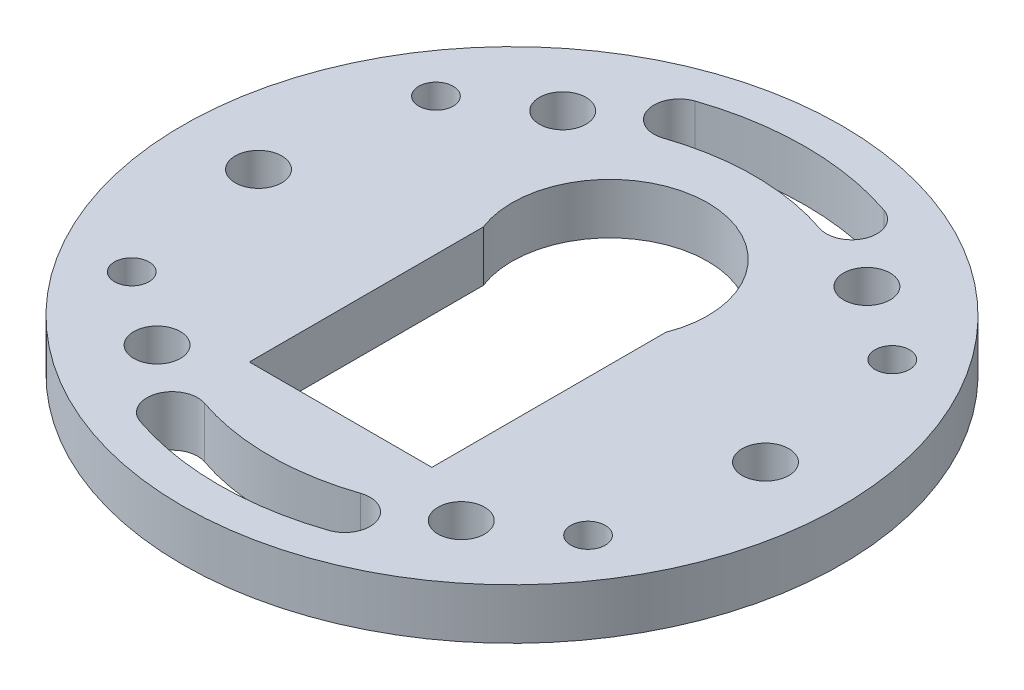
ISO-10303-21;
HEADER;
FILE_DESCRIPTION(('STEP AP214'),'2;1');
FILE_NAME('part.step','',(''),(''),'','','');
FILE_SCHEMA(('AUTOMOTIVE_DESIGN { 1 0 10303 214 1 1 1 1 }'));
ENDSEC;
DATA;
#1=APPLICATION_CONTEXT('core data for automotive mechanical design processes');
#2=APPLICATION_PROTOCOL_DEFINITION('international standard','automotive_design',2000,#1);
#3=PRODUCT_CONTEXT('',#1,'mechanical');
#4=PRODUCT('Part','Part','',(#3));
#5=PRODUCT_RELATED_PRODUCT_CATEGORY('part','',(#4));
#6=PRODUCT_DEFINITION_FORMATION('','',#4);
#7=PRODUCT_DEFINITION_CONTEXT('part definition',#1,'design');
#8=PRODUCT_DEFINITION('design','',#6,#7);
#9=PRODUCT_DEFINITION_SHAPE('','',#8);
#10=(LENGTH_UNIT() NAMED_UNIT(*) SI_UNIT(.MILLI.,.METRE.));
#11=(NAMED_UNIT(*) PLANE_ANGLE_UNIT() SI_UNIT($,.RADIAN.));
#12=(NAMED_UNIT(*) SI_UNIT($,.STERADIAN.) SOLID_ANGLE_UNIT());
#13=UNCERTAINTY_MEASURE_WITH_UNIT(LENGTH_MEASURE(1.E-05),#10,'distance_accuracy_value','');
#14=(GEOMETRIC_REPRESENTATION_CONTEXT(3) GLOBAL_UNCERTAINTY_ASSIGNED_CONTEXT((#13)) GLOBAL_UNIT_ASSIGNED_CONTEXT((#10,
#11,#12)) REPRESENTATION_CONTEXT('',''));
#15=CARTESIAN_POINT('',(0.,0.,0.));
#16=DIRECTION('',(0.,0.,1.));
#17=DIRECTION('',(1.,0.,0.));
#18=AXIS2_PLACEMENT_3D('',#15,#16,#17);
#19=CARTESIAN_POINT('',(0.,5.,0.));
#20=DIRECTION('',(0.,1.,0.));
#21=DIRECTION('',(0.,0.,1.));
#22=AXIS2_PLACEMENT_3D('',#19,#20,#21);
#23=PLANE('',#22);
#24=CARTESIAN_POINT('',(22.5,5.,-15.));
#25=DIRECTION('',(0.,1.,0.));
#26=DIRECTION('',(0.,0.,-1.));
#27=AXIS2_PLACEMENT_3D('',#24,#25,#26);
#28=CIRCLE('',#27,1.7);
#29=CARTESIAN_POINT('',(22.5,5.,-16.7));
#30=VERTEX_POINT('',#29);
#31=EDGE_CURVE('E230',#30,#30,#28,.T.);
#32=ORIENTED_EDGE('',*,*,#31,.F.);
#33=EDGE_LOOP('',(#32));
#34=FACE_BOUND('',#33,.T.);
#35=CARTESIAN_POINT('',(22.5,5.,15.));
#36=DIRECTION('',(0.,1.,0.));
#37=DIRECTION('',(0.,0.,-1.));
#38=AXIS2_PLACEMENT_3D('',#35,#36,#37);
#39=CIRCLE('',#38,1.7);
#40=CARTESIAN_POINT('',(22.5,5.,13.3));
#41=VERTEX_POINT('',#40);
#42=EDGE_CURVE('E242',#41,#41,#39,.T.);
#43=ORIENTED_EDGE('',*,*,#42,.F.);
#44=EDGE_LOOP('',(#43));
#45=FACE_BOUND('',#44,.T.);
#46=CARTESIAN_POINT('',(15.,5.,20.));
#47=DIRECTION('',(0.,1.,0.));
#48=DIRECTION('',(0.,0.,-1.));
#49=AXIS2_PLACEMENT_3D('',#46,#47,#48);
#50=CIRCLE('',#49,2.3);
#51=CARTESIAN_POINT('',(15.,5.,17.7));
#52=VERTEX_POINT('',#51);
#53=EDGE_CURVE('E254',#52,#52,#50,.T.);
#54=ORIENTED_EDGE('',*,*,#53,.F.);
#55=EDGE_LOOP('',(#54));
#56=FACE_BOUND('',#55,.T.);
#57=CARTESIAN_POINT('',(-15.,5.,20.));
#58=DIRECTION('',(0.,1.,0.));
#59=DIRECTION('',(0.,0.,1.));
#60=AXIS2_PLACEMENT_3D('',#57,#58,#59);
#61=CIRCLE('',#60,2.3);
#62=CARTESIAN_POINT('',(-15.,5.,22.3));
#63=VERTEX_POINT('',#62);
#64=EDGE_CURVE('E266',#63,#63,#61,.T.);
#65=ORIENTED_EDGE('',*,*,#64,.F.);
#66=EDGE_LOOP('',(#65));
#67=FACE_BOUND('',#66,.T.);
#68=CARTESIAN_POINT('',(-15.,5.,-20.));
#69=DIRECTION('',(0.,1.,0.));
#70=DIRECTION('',(0.,0.,1.));
#71=AXIS2_PLACEMENT_3D('',#68,#69,#70);
#72=CIRCLE('',#71,2.3);
#73=CARTESIAN_POINT('',(-15.,5.,-17.7));
#74=VERTEX_POINT('',#73);
#75=EDGE_CURVE('E278',#74,#74,#72,.T.);
#76=ORIENTED_EDGE('',*,*,#75,.F.);
#77=EDGE_LOOP('',(#76));
#78=FACE_BOUND('',#77,.T.);
#79=CARTESIAN_POINT('',(0.,5.,0.));
#80=DIRECTION('',(0.,1.,0.));
#81=DIRECTION('',(0.,0.,1.));
#82=AXIS2_PLACEMENT_3D('',#79,#80,#81);
#83=CIRCLE('',#82,32.5);
#84=CARTESIAN_POINT('',(0.,5.,32.5));
#85=VERTEX_POINT('',#84);
#86=EDGE_CURVE('E11',#85,#85,#83,.T.);
#87=ORIENTED_EDGE('',*,*,#86,.T.);
#88=EDGE_LOOP('',(#87));
#89=FACE_BOUND('',#88,.T.);
#90=CARTESIAN_POINT('',(-22.5,5.,-15.));
#91=DIRECTION('',(0.,1.,0.));
#92=DIRECTION('',(0.,0.,1.));
#93=AXIS2_PLACEMENT_3D('',#90,#91,#92);
#94=CIRCLE('',#93,1.7);
#95=CARTESIAN_POINT('',(-22.5,5.,-13.3));
#96=VERTEX_POINT('',#95);
#97=EDGE_CURVE('E272',#96,#96,#94,.T.);
#98=ORIENTED_EDGE('',*,*,#97,.F.);
#99=EDGE_LOOP('',(#98));
#100=FACE_BOUND('',#99,.T.);
#101=CARTESIAN_POINT('',(-25.,5.,0.));
#102=DIRECTION('',(0.,1.,0.));
#103=DIRECTION('',(0.,0.,1.));
#104=AXIS2_PLACEMENT_3D('',#101,#102,#103);
#105=CIRCLE('',#104,2.3);
#106=CARTESIAN_POINT('',(-25.,5.,2.3));
#107=VERTEX_POINT('',#106);
#108=EDGE_CURVE('E260',#107,#107,#105,.T.);
#109=ORIENTED_EDGE('',*,*,#108,.F.);
#110=EDGE_LOOP('',(#109));
#111=FACE_BOUND('',#110,.T.);
#112=CARTESIAN_POINT('',(-22.5,5.,15.));
#113=DIRECTION('',(0.,1.,0.));
#114=DIRECTION('',(0.,0.,1.));
#115=AXIS2_PLACEMENT_3D('',#112,#113,#114);
#116=CIRCLE('',#115,1.7);
#117=CARTESIAN_POINT('',(-22.5,5.,16.7));
#118=VERTEX_POINT('',#117);
#119=EDGE_CURVE('E248',#118,#118,#116,.T.);
#120=ORIENTED_EDGE('',*,*,#119,.F.);
#121=EDGE_LOOP('',(#120));
#122=FACE_BOUND('',#121,.T.);
#123=CARTESIAN_POINT('',(25.,5.,0.));
#124=DIRECTION('',(0.,1.,0.));
#125=DIRECTION('',(0.,0.,-1.));
#126=AXIS2_PLACEMENT_3D('',#123,#124,#125);
#127=CIRCLE('',#126,2.3);
#128=CARTESIAN_POINT('',(25.,5.,-2.3));
#129=VERTEX_POINT('',#128);
#130=EDGE_CURVE('E236',#129,#129,#127,.T.);
#131=ORIENTED_EDGE('',*,*,#130,.F.);
#132=EDGE_LOOP('',(#131));
#133=FACE_BOUND('',#132,.T.);
#134=CARTESIAN_POINT('',(15.,5.,-20.));
#135=DIRECTION('',(0.,1.,0.));
#136=DIRECTION('',(0.,0.,-1.));
#137=AXIS2_PLACEMENT_3D('',#134,#135,#136);
#138=CIRCLE('',#137,2.3);
#139=CARTESIAN_POINT('',(15.,5.,-22.3));
#140=VERTEX_POINT('',#139);
#141=EDGE_CURVE('E224',#140,#140,#138,.T.);
#142=ORIENTED_EDGE('',*,*,#141,.F.);
#143=EDGE_LOOP('',(#142));
#144=FACE_BOUND('',#143,.T.);
#145=CARTESIAN_POINT('',(-8.5,5.,25.));
#146=DIRECTION('',(0.,1.,0.));
#147=DIRECTION('',(0.,0.,-1.));
#148=AXIS2_PLACEMENT_3D('',#145,#146,#147);
#149=CIRCLE('',#148,2.5);
#150=CARTESIAN_POINT('',(-7.69524316690325,5.,22.6330681379507));
#151=VERTEX_POINT('',#150);
#152=CARTESIAN_POINT('',(-9.30475683309676,5.,27.3669318620493));
#153=VERTEX_POINT('',#152);
#154=EDGE_CURVE('E195',#151,#153,#149,.T.);
#155=ORIENTED_EDGE('',*,*,#154,.F.);
#156=CARTESIAN_POINT('',(0.,5.,0.));
#157=DIRECTION('',(0.,-1.,0.));
#158=DIRECTION('',(0.,0.,1.));
#159=AXIS2_PLACEMENT_3D('',#156,#157,#158);
#160=CIRCLE('',#159,23.9054918530218);
#161=CARTESIAN_POINT('',(7.69524316690323,5.,22.6330681379507));
#162=VERTEX_POINT('',#161);
#163=EDGE_CURVE('E193',#162,#151,#160,.T.);
#164=ORIENTED_EDGE('',*,*,#163,.F.);
#165=CARTESIAN_POINT('',(8.49999999999998,5.,25.));
#166=DIRECTION('',(0.,1.,0.));
#167=DIRECTION('',(0.,0.,-1.));
#168=AXIS2_PLACEMENT_3D('',#165,#166,#167);
#169=CIRCLE('',#168,2.5);
#170=CARTESIAN_POINT('',(9.30475683309674,5.,27.3669318620493));
#171=VERTEX_POINT('',#170);
#172=EDGE_CURVE('E201',#171,#162,#169,.T.);
#173=ORIENTED_EDGE('',*,*,#172,.F.);
#174=CARTESIAN_POINT('',(0.,5.,0.));
#175=DIRECTION('',(0.,1.,0.));
#176=DIRECTION('',(0.,0.,1.));
#177=AXIS2_PLACEMENT_3D('',#174,#175,#176);
#178=CIRCLE('',#177,28.9054918530218);
#179=EDGE_CURVE('E198',#153,#171,#178,.T.);
#180=ORIENTED_EDGE('',*,*,#179,.F.);
#181=EDGE_LOOP('',(#155,#164,#173,#180));
#182=FACE_BOUND('',#181,.T.);
#183=CARTESIAN_POINT('',(-8.5,5.,-25.));
#184=DIRECTION('',(0.,1.,0.));
#185=DIRECTION('',(0.,0.,1.));
#186=AXIS2_PLACEMENT_3D('',#183,#184,#185);
#187=CIRCLE('',#186,2.5);
#188=CARTESIAN_POINT('',(-9.30475683309676,5.,-27.3669318620493));
#189=VERTEX_POINT('',#188);
#190=CARTESIAN_POINT('',(-7.69524316690324,5.,-22.6330681379507));
#191=VERTEX_POINT('',#190);
#192=EDGE_CURVE('E164',#189,#191,#187,.T.);
#193=ORIENTED_EDGE('',*,*,#192,.F.);
#194=CARTESIAN_POINT('',(0.,5.,0.));
#195=DIRECTION('',(0.,1.,0.));
#196=DIRECTION('',(0.,0.,-1.));
#197=AXIS2_PLACEMENT_3D('',#194,#195,#196);
#198=CIRCLE('',#197,28.9054918530218);
#199=CARTESIAN_POINT('',(9.30475683309676,5.,-27.3669318620493));
#200=VERTEX_POINT('',#199);
#201=EDGE_CURVE('E162',#200,#189,#198,.T.);
#202=ORIENTED_EDGE('',*,*,#201,.F.);
#203=CARTESIAN_POINT('',(8.5,5.,-25.));
#204=DIRECTION('',(0.,1.,0.));
#205=DIRECTION('',(0.,0.,1.));
#206=AXIS2_PLACEMENT_3D('',#203,#204,#205);
#207=CIRCLE('',#206,2.5);
#208=CARTESIAN_POINT('',(7.69524316690324,5.,-22.6330681379507));
#209=VERTEX_POINT('',#208);
#210=EDGE_CURVE('E170',#209,#200,#207,.T.);
#211=ORIENTED_EDGE('',*,*,#210,.F.);
#212=CARTESIAN_POINT('',(0.,5.,0.));
#213=DIRECTION('',(0.,-1.,0.));
#214=DIRECTION('',(0.,0.,-1.));
#215=AXIS2_PLACEMENT_3D('',#212,#213,#214);
#216=CIRCLE('',#215,23.9054918530218);
#217=EDGE_CURVE('E167',#191,#209,#216,.T.);
#218=ORIENTED_EDGE('',*,*,#217,.F.);
#219=EDGE_LOOP('',(#193,#202,#211,#218));
#220=FACE_BOUND('',#219,.T.);
#221=CARTESIAN_POINT('',(0.,5.,-9.65));
#222=DIRECTION('',(0.,1.,0.));
#223=DIRECTION('',(0.,0.,1.));
#224=AXIS2_PLACEMENT_3D('',#221,#222,#223);
#225=CIRCLE('',#224,9.65);
#226=CARTESIAN_POINT('',(9.,5.,-6.16826192828926));
#227=VERTEX_POINT('',#226);
#228=CARTESIAN_POINT('',(-9.,5.,-6.16826192828926));
#229=VERTEX_POINT('',#228);
#230=EDGE_CURVE('E134',#227,#229,#225,.T.);
#231=ORIENTED_EDGE('',*,*,#230,.F.);
#232=DIRECTION('',(0.,0.,-1.));
#233=VECTOR('',#232,1.);
#234=CARTESIAN_POINT('',(9.,5.,-6.16826192828926));
#235=LINE('',#234,#233);
#236=CARTESIAN_POINT('',(9.,5.,16.9));
#237=VERTEX_POINT('',#236);
#238=EDGE_CURVE('E126',#237,#227,#235,.T.);
#239=ORIENTED_EDGE('',*,*,#238,.F.);
#240=DIRECTION('',(1.,0.,0.));
#241=VECTOR('',#240,1.);
#242=CARTESIAN_POINT('',(-9.,5.,16.9));
#243=LINE('',#242,#241);
#244=CARTESIAN_POINT('',(-9.,5.,16.9));
#245=VERTEX_POINT('',#244);
#246=EDGE_CURVE('E148',#245,#237,#243,.T.);
#247=ORIENTED_EDGE('',*,*,#246,.F.);
#248=DIRECTION('',(0.,0.,1.));
#249=VECTOR('',#248,1.);
#250=CARTESIAN_POINT('',(-9.,5.,-6.16826192828926));
#251=LINE('',#250,#249);
#252=EDGE_CURVE('E146',#229,#245,#251,.T.);
#253=ORIENTED_EDGE('',*,*,#252,.F.);
#254=EDGE_LOOP('',(#231,#239,#247,#253));
#255=FACE_BOUND('',#254,.T.);
#256=ADVANCED_FACE('F37',(#34,#45,#56,#67,#78,#89,#100,#111,#122,#133,#144,#182,#220,#255),#23,.T.);
#257=CARTESIAN_POINT('',(0.,0.,0.));
#258=DIRECTION('',(0.,1.,0.));
#259=DIRECTION('',(0.,0.,1.));
#260=AXIS2_PLACEMENT_3D('',#257,#258,#259);
#261=PLANE('',#260);
#262=CARTESIAN_POINT('',(0.,0.,0.));
#263=DIRECTION('',(0.,1.,0.));
#264=DIRECTION('',(0.,0.,-1.));
#265=AXIS2_PLACEMENT_3D('',#262,#263,#264);
#266=CIRCLE('',#265,28.9054918530218);
#267=CARTESIAN_POINT('',(9.30475683309676,0.,-27.3669318620493));
#268=VERTEX_POINT('',#267);
#269=CARTESIAN_POINT('',(-9.30475683309676,0.,-27.3669318620493));
#270=VERTEX_POINT('',#269);
#271=EDGE_CURVE('E142',#268,#270,#266,.T.);
#272=ORIENTED_EDGE('',*,*,#271,.T.);
#273=CARTESIAN_POINT('',(-8.5,0.,-25.));
#274=DIRECTION('',(0.,1.,0.));
#275=DIRECTION('',(0.,0.,1.));
#276=AXIS2_PLACEMENT_3D('',#273,#274,#275);
#277=CIRCLE('',#276,2.5);
#278=CARTESIAN_POINT('',(-7.69524316690324,0.,-22.6330681379507));
#279=VERTEX_POINT('',#278);
#280=EDGE_CURVE('E175',#270,#279,#277,.T.);
#281=ORIENTED_EDGE('',*,*,#280,.T.);
#282=CARTESIAN_POINT('',(0.,0.,0.));
#283=DIRECTION('',(0.,-1.,0.));
#284=DIRECTION('',(0.,0.,-1.));
#285=AXIS2_PLACEMENT_3D('',#282,#283,#284);
#286=CIRCLE('',#285,23.9054918530218);
#287=CARTESIAN_POINT('',(7.69524316690324,0.,-22.6330681379507));
#288=VERTEX_POINT('',#287);
#289=EDGE_CURVE('E178',#279,#288,#286,.T.);
#290=ORIENTED_EDGE('',*,*,#289,.T.);
#291=CARTESIAN_POINT('',(8.5,0.,-25.));
#292=DIRECTION('',(0.,1.,0.));
#293=DIRECTION('',(0.,0.,1.));
#294=AXIS2_PLACEMENT_3D('',#291,#292,#293);
#295=CIRCLE('',#294,2.5);
#296=EDGE_CURVE('E165',#288,#268,#295,.T.);
#297=ORIENTED_EDGE('',*,*,#296,.T.);
#298=EDGE_LOOP('',(#272,#281,#290,#297));
#299=FACE_BOUND('',#298,.T.);
#300=CARTESIAN_POINT('',(15.,0.,-20.));
#301=DIRECTION('',(0.,1.,0.));
#302=DIRECTION('',(0.,0.,-1.));
#303=AXIS2_PLACEMENT_3D('',#300,#301,#302);
#304=CIRCLE('',#303,2.3);
#305=CARTESIAN_POINT('',(15.,0.,-22.3));
#306=VERTEX_POINT('',#305);
#307=EDGE_CURVE('E223',#306,#306,#304,.T.);
#308=ORIENTED_EDGE('',*,*,#307,.T.);
#309=EDGE_LOOP('',(#308));
#310=FACE_BOUND('',#309,.T.);
#311=CARTESIAN_POINT('',(22.5,0.,-15.));
#312=DIRECTION('',(0.,1.,0.));
#313=DIRECTION('',(0.,0.,-1.));
#314=AXIS2_PLACEMENT_3D('',#311,#312,#313);
#315=CIRCLE('',#314,1.7);
#316=CARTESIAN_POINT('',(22.5,0.,-16.7));
#317=VERTEX_POINT('',#316);
#318=EDGE_CURVE('E227',#317,#317,#315,.T.);
#319=ORIENTED_EDGE('',*,*,#318,.T.);
#320=EDGE_LOOP('',(#319));
#321=FACE_BOUND('',#320,.T.);
#322=CARTESIAN_POINT('',(25.,0.,0.));
#323=DIRECTION('',(0.,1.,0.));
#324=DIRECTION('',(0.,0.,-1.));
#325=AXIS2_PLACEMENT_3D('',#322,#323,#324);
#326=CIRCLE('',#325,2.3);
#327=CARTESIAN_POINT('',(25.,0.,-2.3));
#328=VERTEX_POINT('',#327);
#329=EDGE_CURVE('E233',#328,#328,#326,.T.);
#330=ORIENTED_EDGE('',*,*,#329,.T.);
#331=EDGE_LOOP('',(#330));
#332=FACE_BOUND('',#331,.T.);
#333=CARTESIAN_POINT('',(22.5,0.,15.));
#334=DIRECTION('',(0.,1.,0.));
#335=DIRECTION('',(0.,0.,-1.));
#336=AXIS2_PLACEMENT_3D('',#333,#334,#335);
#337=CIRCLE('',#336,1.7);
#338=CARTESIAN_POINT('',(22.5,0.,13.3));
#339=VERTEX_POINT('',#338);
#340=EDGE_CURVE('E239',#339,#339,#337,.T.);
#341=ORIENTED_EDGE('',*,*,#340,.T.);
#342=EDGE_LOOP('',(#341));
#343=FACE_BOUND('',#342,.T.);
#344=CARTESIAN_POINT('',(-22.5,0.,15.));
#345=DIRECTION('',(0.,1.,0.));
#346=DIRECTION('',(0.,0.,1.));
#347=AXIS2_PLACEMENT_3D('',#344,#345,#346);
#348=CIRCLE('',#347,1.7);
#349=CARTESIAN_POINT('',(-22.5,0.,16.7));
#350=VERTEX_POINT('',#349);
#351=EDGE_CURVE('E245',#350,#350,#348,.T.);
#352=ORIENTED_EDGE('',*,*,#351,.T.);
#353=EDGE_LOOP('',(#352));
#354=FACE_BOUND('',#353,.T.);
#355=CARTESIAN_POINT('',(15.,0.,20.));
#356=DIRECTION('',(0.,1.,0.));
#357=DIRECTION('',(0.,0.,-1.));
#358=AXIS2_PLACEMENT_3D('',#355,#356,#357);
#359=CIRCLE('',#358,2.3);
#360=CARTESIAN_POINT('',(15.,0.,17.7));
#361=VERTEX_POINT('',#360);
#362=EDGE_CURVE('E251',#361,#361,#359,.T.);
#363=ORIENTED_EDGE('',*,*,#362,.T.);
#364=EDGE_LOOP('',(#363));
#365=FACE_BOUND('',#364,.T.);
#366=CARTESIAN_POINT('',(-25.,0.,0.));
#367=DIRECTION('',(0.,1.,0.));
#368=DIRECTION('',(0.,0.,1.));
#369=AXIS2_PLACEMENT_3D('',#366,#367,#368);
#370=CIRCLE('',#369,2.3);
#371=CARTESIAN_POINT('',(-25.,0.,2.3));
#372=VERTEX_POINT('',#371);
#373=EDGE_CURVE('E257',#372,#372,#370,.T.);
#374=ORIENTED_EDGE('',*,*,#373,.T.);
#375=EDGE_LOOP('',(#374));
#376=FACE_BOUND('',#375,.T.);
#377=CARTESIAN_POINT('',(-15.,0.,20.));
#378=DIRECTION('',(0.,1.,0.));
#379=DIRECTION('',(0.,0.,1.));
#380=AXIS2_PLACEMENT_3D('',#377,#378,#379);
#381=CIRCLE('',#380,2.3);
#382=CARTESIAN_POINT('',(-15.,0.,22.3));
#383=VERTEX_POINT('',#382);
#384=EDGE_CURVE('E263',#383,#383,#381,.T.);
#385=ORIENTED_EDGE('',*,*,#384,.T.);
#386=EDGE_LOOP('',(#385));
#387=FACE_BOUND('',#386,.T.);
#388=CARTESIAN_POINT('',(-22.5,0.,-15.));
#389=DIRECTION('',(0.,1.,0.));
#390=DIRECTION('',(0.,0.,1.));
#391=AXIS2_PLACEMENT_3D('',#388,#389,#390);
#392=CIRCLE('',#391,1.7);
#393=CARTESIAN_POINT('',(-22.5,0.,-13.3));
#394=VERTEX_POINT('',#393);
#395=EDGE_CURVE('E269',#394,#394,#392,.T.);
#396=ORIENTED_EDGE('',*,*,#395,.T.);
#397=EDGE_LOOP('',(#396));
#398=FACE_BOUND('',#397,.T.);
#399=CARTESIAN_POINT('',(-15.,0.,-20.));
#400=DIRECTION('',(0.,1.,0.));
#401=DIRECTION('',(0.,0.,1.));
#402=AXIS2_PLACEMENT_3D('',#399,#400,#401);
#403=CIRCLE('',#402,2.3);
#404=CARTESIAN_POINT('',(-15.,0.,-17.7));
#405=VERTEX_POINT('',#404);
#406=EDGE_CURVE('E275',#405,#405,#403,.T.);
#407=ORIENTED_EDGE('',*,*,#406,.T.);
#408=EDGE_LOOP('',(#407));
#409=FACE_BOUND('',#408,.T.);
#410=CARTESIAN_POINT('',(0.,0.,0.));
#411=DIRECTION('',(0.,1.,0.));
#412=DIRECTION('',(0.,0.,1.));
#413=AXIS2_PLACEMENT_3D('',#410,#411,#412);
#414=CIRCLE('',#413,32.5);
#415=CARTESIAN_POINT('',(0.,0.,32.5));
#416=VERTEX_POINT('',#415);
#417=EDGE_CURVE('E41',#416,#416,#414,.T.);
#418=ORIENTED_EDGE('',*,*,#417,.F.);
#419=EDGE_LOOP('',(#418));
#420=FACE_BOUND('',#419,.T.);
#421=CARTESIAN_POINT('',(0.,0.,0.));
#422=DIRECTION('',(0.,-1.,0.));
#423=DIRECTION('',(0.,0.,1.));
#424=AXIS2_PLACEMENT_3D('',#421,#422,#423);
#425=CIRCLE('',#424,23.9054918530218);
#426=CARTESIAN_POINT('',(7.69524316690323,0.,22.6330681379507));
#427=VERTEX_POINT('',#426);
#428=CARTESIAN_POINT('',(-7.69524316690325,0.,22.6330681379507));
#429=VERTEX_POINT('',#428);
#430=EDGE_CURVE('E192',#427,#429,#425,.T.);
#431=ORIENTED_EDGE('',*,*,#430,.T.);
#432=CARTESIAN_POINT('',(-8.5,0.,25.));
#433=DIRECTION('',(0.,1.,0.));
#434=DIRECTION('',(0.,0.,-1.));
#435=AXIS2_PLACEMENT_3D('',#432,#433,#434);
#436=CIRCLE('',#435,2.5);
#437=CARTESIAN_POINT('',(-9.30475683309676,0.,27.3669318620493));
#438=VERTEX_POINT('',#437);
#439=EDGE_CURVE('E206',#429,#438,#436,.T.);
#440=ORIENTED_EDGE('',*,*,#439,.T.);
#441=CARTESIAN_POINT('',(0.,0.,0.));
#442=DIRECTION('',(0.,1.,0.));
#443=DIRECTION('',(0.,0.,1.));
#444=AXIS2_PLACEMENT_3D('',#441,#442,#443);
#445=CIRCLE('',#444,28.9054918530218);
#446=CARTESIAN_POINT('',(9.30475683309674,0.,27.3669318620493));
#447=VERTEX_POINT('',#446);
#448=EDGE_CURVE('E209',#438,#447,#445,.T.);
#449=ORIENTED_EDGE('',*,*,#448,.T.);
#450=CARTESIAN_POINT('',(8.49999999999998,0.,25.));
#451=DIRECTION('',(0.,1.,0.));
#452=DIRECTION('',(0.,0.,-1.));
#453=AXIS2_PLACEMENT_3D('',#450,#451,#452);
#454=CIRCLE('',#453,2.5);
#455=EDGE_CURVE('E196',#447,#427,#454,.T.);
#456=ORIENTED_EDGE('',*,*,#455,.T.);
#457=EDGE_LOOP('',(#431,#440,#449,#456));
#458=FACE_BOUND('',#457,.T.);
#459=DIRECTION('',(0.,0.,-1.));
#460=VECTOR('',#459,1.);
#461=CARTESIAN_POINT('',(9.,0.,-6.16826192828926));
#462=LINE('',#461,#460);
#463=CARTESIAN_POINT('',(9.,0.,16.9));
#464=VERTEX_POINT('',#463);
#465=CARTESIAN_POINT('',(9.,0.,-6.16826192828926));
#466=VERTEX_POINT('',#465);
#467=EDGE_CURVE('E60',#464,#466,#462,.T.);
#468=ORIENTED_EDGE('',*,*,#467,.T.);
#469=CARTESIAN_POINT('',(0.,0.,-9.65));
#470=DIRECTION('',(0.,1.,0.));
#471=DIRECTION('',(0.,0.,1.));
#472=AXIS2_PLACEMENT_3D('',#469,#470,#471);
#473=CIRCLE('',#472,9.65);
#474=CARTESIAN_POINT('',(-9.,0.,-6.16826192828926));
#475=VERTEX_POINT('',#474);
#476=EDGE_CURVE('E141',#466,#475,#473,.T.);
#477=ORIENTED_EDGE('',*,*,#476,.T.);
#478=DIRECTION('',(0.,0.,1.));
#479=VECTOR('',#478,1.);
#480=CARTESIAN_POINT('',(-9.,0.,-6.16826192828926));
#481=LINE('',#480,#479);
#482=CARTESIAN_POINT('',(-9.,0.,16.9));
#483=VERTEX_POINT('',#482);
#484=EDGE_CURVE('E154',#475,#483,#481,.T.);
#485=ORIENTED_EDGE('',*,*,#484,.T.);
#486=DIRECTION('',(1.,0.,0.));
#487=VECTOR('',#486,1.);
#488=CARTESIAN_POINT('',(-9.,0.,16.9));
#489=LINE('',#488,#487);
#490=EDGE_CURVE('E135',#483,#464,#489,.T.);
#491=ORIENTED_EDGE('',*,*,#490,.T.);
#492=EDGE_LOOP('',(#468,#477,#485,#491));
#493=FACE_BOUND('',#492,.T.);
#494=ADVANCED_FACE('F284',(#299,#310,#321,#332,#343,#354,#365,#376,#387,#398,#409,#420,#458,
#493),#261,.F.);
#495=CARTESIAN_POINT('',(0.,5.,0.));
#496=DIRECTION('',(0.,-1.,0.));
#497=DIRECTION('',(0.,0.,-1.));
#498=AXIS2_PLACEMENT_3D('',#495,#496,#497);
#499=CYLINDRICAL_SURFACE('',#498,32.5);
#500=ORIENTED_EDGE('',*,*,#86,.F.);
#501=EDGE_LOOP('',(#500));
#502=FACE_BOUND('',#501,.T.);
#503=ORIENTED_EDGE('',*,*,#417,.T.);
#504=EDGE_LOOP('',(#503));
#505=FACE_BOUND('',#504,.T.);
#506=ADVANCED_FACE('F39',(#502,#505),#499,.T.);
#507=CARTESIAN_POINT('',(-15.,5.,-20.));
#508=DIRECTION('',(0.,-1.,0.));
#509=DIRECTION('',(0.,0.,-1.));
#510=AXIS2_PLACEMENT_3D('',#507,#508,#509);
#511=CYLINDRICAL_SURFACE('',#510,2.3);
#512=ORIENTED_EDGE('',*,*,#75,.T.);
#513=EDGE_LOOP('',(#512));
#514=FACE_BOUND('',#513,.T.);
#515=ORIENTED_EDGE('',*,*,#406,.F.);
#516=EDGE_LOOP('',(#515));
#517=FACE_BOUND('',#516,.T.);
#518=ADVANCED_FACE('F287',(#514,#517),#511,.F.);
#519=CARTESIAN_POINT('',(-22.5,5.,-15.));
#520=DIRECTION('',(0.,-1.,0.));
#521=DIRECTION('',(0.,0.,-1.));
#522=AXIS2_PLACEMENT_3D('',#519,#520,#521);
#523=CYLINDRICAL_SURFACE('',#522,1.7);
#524=ORIENTED_EDGE('',*,*,#97,.T.);
#525=EDGE_LOOP('',(#524));
#526=FACE_BOUND('',#525,.T.);
#527=ORIENTED_EDGE('',*,*,#395,.F.);
#528=EDGE_LOOP('',(#527));
#529=FACE_BOUND('',#528,.T.);
#530=ADVANCED_FACE('F289',(#526,#529),#523,.F.);
#531=CARTESIAN_POINT('',(-15.,5.,20.));
#532=DIRECTION('',(0.,-1.,0.));
#533=DIRECTION('',(0.,0.,-1.));
#534=AXIS2_PLACEMENT_3D('',#531,#532,#533);
#535=CYLINDRICAL_SURFACE('',#534,2.3);
#536=ORIENTED_EDGE('',*,*,#64,.T.);
#537=EDGE_LOOP('',(#536));
#538=FACE_BOUND('',#537,.T.);
#539=ORIENTED_EDGE('',*,*,#384,.F.);
#540=EDGE_LOOP('',(#539));
#541=FACE_BOUND('',#540,.T.);
#542=ADVANCED_FACE('F296',(#538,#541),#535,.F.);
#543=CARTESIAN_POINT('',(-25.,5.,0.));
#544=DIRECTION('',(0.,-1.,0.));
#545=DIRECTION('',(0.,0.,-1.));
#546=AXIS2_PLACEMENT_3D('',#543,#544,#545);
#547=CYLINDRICAL_SURFACE('',#546,2.3);
#548=ORIENTED_EDGE('',*,*,#108,.T.);
#549=EDGE_LOOP('',(#548));
#550=FACE_BOUND('',#549,.T.);
#551=ORIENTED_EDGE('',*,*,#373,.F.);
#552=EDGE_LOOP('',(#551));
#553=FACE_BOUND('',#552,.T.);
#554=ADVANCED_FACE('F404',(#550,#553),#547,.F.);
#555=CARTESIAN_POINT('',(15.,5.,20.));
#556=DIRECTION('',(0.,-1.,0.));
#557=DIRECTION('',(0.,0.,-1.));
#558=AXIS2_PLACEMENT_3D('',#555,#556,#557);
#559=CYLINDRICAL_SURFACE('',#558,2.3);
#560=ORIENTED_EDGE('',*,*,#53,.T.);
#561=EDGE_LOOP('',(#560));
#562=FACE_BOUND('',#561,.T.);
#563=ORIENTED_EDGE('',*,*,#362,.F.);
#564=EDGE_LOOP('',(#563));
#565=FACE_BOUND('',#564,.T.);
#566=ADVANCED_FACE('F400',(#562,#565),#559,.F.);
#567=CARTESIAN_POINT('',(-22.5,5.,15.));
#568=DIRECTION('',(0.,-1.,0.));
#569=DIRECTION('',(0.,0.,-1.));
#570=AXIS2_PLACEMENT_3D('',#567,#568,#569);
#571=CYLINDRICAL_SURFACE('',#570,1.7);
#572=ORIENTED_EDGE('',*,*,#119,.T.);
#573=EDGE_LOOP('',(#572));
#574=FACE_BOUND('',#573,.T.);
#575=ORIENTED_EDGE('',*,*,#351,.F.);
#576=EDGE_LOOP('',(#575));
#577=FACE_BOUND('',#576,.T.);
#578=ADVANCED_FACE('F396',(#574,#577),#571,.F.);
#579=CARTESIAN_POINT('',(22.5,5.,15.));
#580=DIRECTION('',(0.,-1.,0.));
#581=DIRECTION('',(0.,0.,-1.));
#582=AXIS2_PLACEMENT_3D('',#579,#580,#581);
#583=CYLINDRICAL_SURFACE('',#582,1.7);
#584=ORIENTED_EDGE('',*,*,#42,.T.);
#585=EDGE_LOOP('',(#584));
#586=FACE_BOUND('',#585,.T.);
#587=ORIENTED_EDGE('',*,*,#340,.F.);
#588=EDGE_LOOP('',(#587));
#589=FACE_BOUND('',#588,.T.);
#590=ADVANCED_FACE('F392',(#586,#589),#583,.F.);
#591=CARTESIAN_POINT('',(25.,5.,0.));
#592=DIRECTION('',(0.,-1.,0.));
#593=DIRECTION('',(0.,0.,-1.));
#594=AXIS2_PLACEMENT_3D('',#591,#592,#593);
#595=CYLINDRICAL_SURFACE('',#594,2.3);
#596=ORIENTED_EDGE('',*,*,#130,.T.);
#597=EDGE_LOOP('',(#596));
#598=FACE_BOUND('',#597,.T.);
#599=ORIENTED_EDGE('',*,*,#329,.F.);
#600=EDGE_LOOP('',(#599));
#601=FACE_BOUND('',#600,.T.);
#602=ADVANCED_FACE('F388',(#598,#601),#595,.F.);
#603=CARTESIAN_POINT('',(22.5,5.,-15.));
#604=DIRECTION('',(0.,-1.,0.));
#605=DIRECTION('',(0.,0.,-1.));
#606=AXIS2_PLACEMENT_3D('',#603,#604,#605);
#607=CYLINDRICAL_SURFACE('',#606,1.7);
#608=ORIENTED_EDGE('',*,*,#31,.T.);
#609=EDGE_LOOP('',(#608));
#610=FACE_BOUND('',#609,.T.);
#611=ORIENTED_EDGE('',*,*,#318,.F.);
#612=EDGE_LOOP('',(#611));
#613=FACE_BOUND('',#612,.T.);
#614=ADVANCED_FACE('F384',(#610,#613),#607,.F.);
#615=CARTESIAN_POINT('',(15.,5.,-20.));
#616=DIRECTION('',(0.,-1.,0.));
#617=DIRECTION('',(0.,0.,-1.));
#618=AXIS2_PLACEMENT_3D('',#615,#616,#617);
#619=CYLINDRICAL_SURFACE('',#618,2.3);
#620=ORIENTED_EDGE('',*,*,#141,.T.);
#621=EDGE_LOOP('',(#620));
#622=FACE_BOUND('',#621,.T.);
#623=ORIENTED_EDGE('',*,*,#307,.F.);
#624=EDGE_LOOP('',(#623));
#625=FACE_BOUND('',#624,.T.);
#626=ADVANCED_FACE('F380',(#622,#625),#619,.F.);
#627=CARTESIAN_POINT('',(0.,5.,0.));
#628=DIRECTION('',(0.,-1.,0.));
#629=DIRECTION('',(0.,0.,-1.));
#630=AXIS2_PLACEMENT_3D('',#627,#628,#629);
#631=CYLINDRICAL_SURFACE('',#630,23.9054918530218);
#632=ORIENTED_EDGE('',*,*,#430,.F.);
#633=DIRECTION('',(0.,-1.,0.));
#634=VECTOR('',#633,1.);
#635=CARTESIAN_POINT('',(7.69524316690323,5.,22.6330681379507));
#636=LINE('',#635,#634);
#637=EDGE_CURVE('E203',#162,#427,#636,.T.);
#638=ORIENTED_EDGE('',*,*,#637,.F.);
#639=ORIENTED_EDGE('',*,*,#163,.T.);
#640=DIRECTION('',(0.,-1.,0.));
#641=VECTOR('',#640,1.);
#642=CARTESIAN_POINT('',(-7.69524316690325,5.,22.6330681379507));
#643=LINE('',#642,#641);
#644=EDGE_CURVE('E220',#151,#429,#643,.T.);
#645=ORIENTED_EDGE('',*,*,#644,.T.);
#646=EDGE_LOOP('',(#632,#638,#639,#645));
#647=FACE_BOUND('',#646,.T.);
#648=ADVANCED_FACE('F376',(#647),#631,.T.);
#649=CARTESIAN_POINT('',(-8.5,5.,25.));
#650=DIRECTION('',(0.,-1.,0.));
#651=DIRECTION('',(0.,0.,-1.));
#652=AXIS2_PLACEMENT_3D('',#649,#650,#651);
#653=CYLINDRICAL_SURFACE('',#652,2.5);
#654=ORIENTED_EDGE('',*,*,#439,.F.);
#655=ORIENTED_EDGE('',*,*,#644,.F.);
#656=ORIENTED_EDGE('',*,*,#154,.T.);
#657=DIRECTION('',(0.,-1.,0.));
#658=VECTOR('',#657,1.);
#659=CARTESIAN_POINT('',(-9.30475683309676,5.,27.3669318620493));
#660=LINE('',#659,#658);
#661=EDGE_CURVE('E218',#153,#438,#660,.T.);
#662=ORIENTED_EDGE('',*,*,#661,.T.);
#663=EDGE_LOOP('',(#654,#655,#656,#662));
#664=FACE_BOUND('',#663,.T.);
#665=ADVANCED_FACE('F372',(#664),#653,.F.);
#666=CARTESIAN_POINT('',(0.,5.,0.));
#667=DIRECTION('',(0.,-1.,0.));
#668=DIRECTION('',(0.,0.,-1.));
#669=AXIS2_PLACEMENT_3D('',#666,#667,#668);
#670=CYLINDRICAL_SURFACE('',#669,28.9054918530218);
#671=ORIENTED_EDGE('',*,*,#448,.F.);
#672=ORIENTED_EDGE('',*,*,#661,.F.);
#673=ORIENTED_EDGE('',*,*,#179,.T.);
#674=DIRECTION('',(0.,-1.,0.));
#675=VECTOR('',#674,1.);
#676=CARTESIAN_POINT('',(9.30475683309674,5.,27.3669318620493));
#677=LINE('',#676,#675);
#678=EDGE_CURVE('E216',#171,#447,#677,.T.);
#679=ORIENTED_EDGE('',*,*,#678,.T.);
#680=EDGE_LOOP('',(#671,#672,#673,#679));
#681=FACE_BOUND('',#680,.T.);
#682=ADVANCED_FACE('F368',(#681),#670,.F.);
#683=CARTESIAN_POINT('',(8.49999999999998,5.,25.));
#684=DIRECTION('',(0.,-1.,0.));
#685=DIRECTION('',(0.,0.,-1.));
#686=AXIS2_PLACEMENT_3D('',#683,#684,#685);
#687=CYLINDRICAL_SURFACE('',#686,2.5);
#688=ORIENTED_EDGE('',*,*,#455,.F.);
#689=ORIENTED_EDGE('',*,*,#678,.F.);
#690=ORIENTED_EDGE('',*,*,#172,.T.);
#691=ORIENTED_EDGE('',*,*,#637,.T.);
#692=EDGE_LOOP('',(#688,#689,#690,#691));
#693=FACE_BOUND('',#692,.T.);
#694=ADVANCED_FACE('F365',(#693),#687,.F.);
#695=CARTESIAN_POINT('',(0.,5.,0.));
#696=DIRECTION('',(0.,-1.,0.));
#697=DIRECTION('',(0.,0.,-1.));
#698=AXIS2_PLACEMENT_3D('',#695,#696,#697);
#699=CYLINDRICAL_SURFACE('',#698,28.9054918530218);
#700=ORIENTED_EDGE('',*,*,#271,.F.);
#701=DIRECTION('',(0.,-1.,0.));
#702=VECTOR('',#701,1.);
#703=CARTESIAN_POINT('',(9.30475683309676,5.,-27.3669318620493));
#704=LINE('',#703,#702);
#705=EDGE_CURVE('E172',#200,#268,#704,.T.);
#706=ORIENTED_EDGE('',*,*,#705,.F.);
#707=ORIENTED_EDGE('',*,*,#201,.T.);
#708=DIRECTION('',(0.,-1.,0.));
#709=VECTOR('',#708,1.);
#710=CARTESIAN_POINT('',(-9.30475683309676,5.,-27.3669318620493));
#711=LINE('',#710,#709);
#712=EDGE_CURVE('E189',#189,#270,#711,.T.);
#713=ORIENTED_EDGE('',*,*,#712,.T.);
#714=EDGE_LOOP('',(#700,#706,#707,#713));
#715=FACE_BOUND('',#714,.T.);
#716=ADVANCED_FACE('F347',(#715),#699,.F.);
#717=CARTESIAN_POINT('',(-8.5,5.,-25.));
#718=DIRECTION('',(0.,-1.,0.));
#719=DIRECTION('',(0.,0.,-1.));
#720=AXIS2_PLACEMENT_3D('',#717,#718,#719);
#721=CYLINDRICAL_SURFACE('',#720,2.5);
#722=ORIENTED_EDGE('',*,*,#280,.F.);
#723=ORIENTED_EDGE('',*,*,#712,.F.);
#724=ORIENTED_EDGE('',*,*,#192,.T.);
#725=DIRECTION('',(0.,-1.,0.));
#726=VECTOR('',#725,1.);
#727=CARTESIAN_POINT('',(-7.69524316690324,5.,-22.6330681379507));
#728=LINE('',#727,#726);
#729=EDGE_CURVE('E187',#191,#279,#728,.T.);
#730=ORIENTED_EDGE('',*,*,#729,.T.);
#731=EDGE_LOOP('',(#722,#723,#724,#730));
#732=FACE_BOUND('',#731,.T.);
#733=ADVANCED_FACE('F340',(#732),#721,.F.);
#734=CARTESIAN_POINT('',(0.,5.,0.));
#735=DIRECTION('',(0.,-1.,0.));
#736=DIRECTION('',(0.,0.,-1.));
#737=AXIS2_PLACEMENT_3D('',#734,#735,#736);
#738=CYLINDRICAL_SURFACE('',#737,23.9054918530218);
#739=ORIENTED_EDGE('',*,*,#289,.F.);
#740=ORIENTED_EDGE('',*,*,#729,.F.);
#741=ORIENTED_EDGE('',*,*,#217,.T.);
#742=DIRECTION('',(0.,-1.,0.));
#743=VECTOR('',#742,1.);
#744=CARTESIAN_POINT('',(7.69524316690324,5.,-22.6330681379507));
#745=LINE('',#744,#743);
#746=EDGE_CURVE('E185',#209,#288,#745,.T.);
#747=ORIENTED_EDGE('',*,*,#746,.T.);
#748=EDGE_LOOP('',(#739,#740,#741,#747));
#749=FACE_BOUND('',#748,.T.);
#750=ADVANCED_FACE('F343',(#749),#738,.T.);
#751=CARTESIAN_POINT('',(8.5,5.,-25.));
#752=DIRECTION('',(0.,-1.,0.));
#753=DIRECTION('',(0.,0.,-1.));
#754=AXIS2_PLACEMENT_3D('',#751,#752,#753);
#755=CYLINDRICAL_SURFACE('',#754,2.5);
#756=ORIENTED_EDGE('',*,*,#296,.F.);
#757=ORIENTED_EDGE('',*,*,#746,.F.);
#758=ORIENTED_EDGE('',*,*,#210,.T.);
#759=ORIENTED_EDGE('',*,*,#705,.T.);
#760=EDGE_LOOP('',(#756,#757,#758,#759));
#761=FACE_BOUND('',#760,.T.);
#762=ADVANCED_FACE('F350',(#761),#755,.F.);
#763=CARTESIAN_POINT('',(9.,5.,-6.16826192828926));
#764=DIRECTION('',(-1.,0.,0.));
#765=DIRECTION('',(0.,0.,1.));
#766=AXIS2_PLACEMENT_3D('',#763,#764,#765);
#767=PLANE('',#766);
#768=ORIENTED_EDGE('',*,*,#467,.F.);
#769=DIRECTION('',(0.,-1.,0.));
#770=VECTOR('',#769,1.);
#771=CARTESIAN_POINT('',(9.,5.,16.9));
#772=LINE('',#771,#770);
#773=EDGE_CURVE('E130',#237,#464,#772,.T.);
#774=ORIENTED_EDGE('',*,*,#773,.F.);
#775=ORIENTED_EDGE('',*,*,#238,.T.);
#776=DIRECTION('',(0.,-1.,0.));
#777=VECTOR('',#776,1.);
#778=CARTESIAN_POINT('',(9.,5.,-6.16826192828926));
#779=LINE('',#778,#777);
#780=EDGE_CURVE('E129',#227,#466,#779,.T.);
#781=ORIENTED_EDGE('',*,*,#780,.T.);
#782=EDGE_LOOP('',(#768,#774,#775,#781));
#783=FACE_BOUND('',#782,.T.);
#784=ADVANCED_FACE('F128',(#783),#767,.T.);
#785=CARTESIAN_POINT('',(0.,5.,-9.65));
#786=DIRECTION('',(0.,-1.,0.));
#787=DIRECTION('',(0.,0.,-1.));
#788=AXIS2_PLACEMENT_3D('',#785,#786,#787);
#789=CYLINDRICAL_SURFACE('',#788,9.65);
#790=ORIENTED_EDGE('',*,*,#476,.F.);
#791=ORIENTED_EDGE('',*,*,#780,.F.);
#792=ORIENTED_EDGE('',*,*,#230,.T.);
#793=DIRECTION('',(0.,-1.,0.));
#794=VECTOR('',#793,1.);
#795=CARTESIAN_POINT('',(-9.,5.,-6.16826192828926));
#796=LINE('',#795,#794);
#797=EDGE_CURVE('E143',#229,#475,#796,.T.);
#798=ORIENTED_EDGE('',*,*,#797,.T.);
#799=EDGE_LOOP('',(#790,#791,#792,#798));
#800=FACE_BOUND('',#799,.T.);
#801=ADVANCED_FACE('F138',(#800),#789,.F.);
#802=CARTESIAN_POINT('',(-9.,5.,-6.16826192828926));
#803=DIRECTION('',(1.,0.,0.));
#804=DIRECTION('',(0.,0.,-1.));
#805=AXIS2_PLACEMENT_3D('',#802,#803,#804);
#806=PLANE('',#805);
#807=ORIENTED_EDGE('',*,*,#484,.F.);
#808=ORIENTED_EDGE('',*,*,#797,.F.);
#809=ORIENTED_EDGE('',*,*,#252,.T.);
#810=DIRECTION('',(0.,-1.,0.));
#811=VECTOR('',#810,1.);
#812=CARTESIAN_POINT('',(-9.,5.,16.9));
#813=LINE('',#812,#811);
#814=EDGE_CURVE('E52',#245,#483,#813,.T.);
#815=ORIENTED_EDGE('',*,*,#814,.T.);
#816=EDGE_LOOP('',(#807,#808,#809,#815));
#817=FACE_BOUND('',#816,.T.);
#818=ADVANCED_FACE('F496',(#817),#806,.T.);
#819=CARTESIAN_POINT('',(-9.,5.,16.9));
#820=DIRECTION('',(0.,0.,-1.));
#821=DIRECTION('',(-1.,0.,0.));
#822=AXIS2_PLACEMENT_3D('',#819,#820,#821);
#823=PLANE('',#822);
#824=ORIENTED_EDGE('',*,*,#490,.F.);
#825=ORIENTED_EDGE('',*,*,#814,.F.);
#826=ORIENTED_EDGE('',*,*,#246,.T.);
#827=ORIENTED_EDGE('',*,*,#773,.T.);
#828=EDGE_LOOP('',(#824,#825,#826,#827));
#829=FACE_BOUND('',#828,.T.);
#830=ADVANCED_FACE('F504',(#829),#823,.T.);
#831=CLOSED_SHELL('',(#256,#494,#506,#518,#530,#542,#554,#566,#578,#590,#602,#614,#626,#648,
#665,#682,#694,#716,#733,#750,#762,#784,#801,#818,#830));
#832=MANIFOLD_SOLID_BREP('B2',#831);
#833=ADVANCED_BREP_SHAPE_REPRESENTATION('',(#18,#832),#14);
#834=SHAPE_DEFINITION_REPRESENTATION(#9,#833);
ENDSEC;
END-ISO-10303-21;
